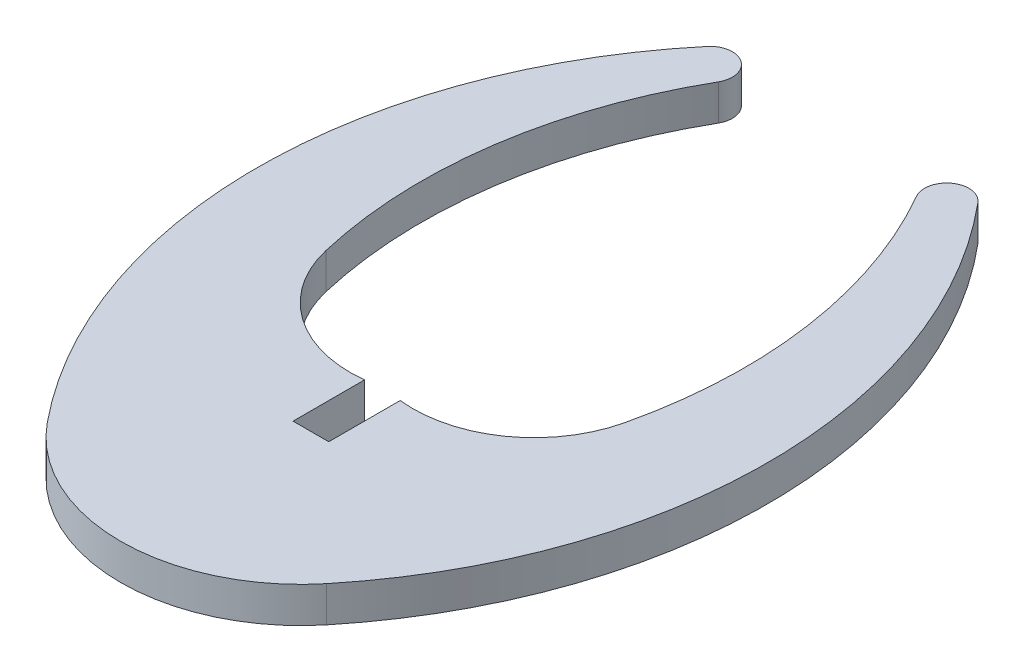
ISO-10303-21;
HEADER;
FILE_DESCRIPTION(('STEP AP214'),'2;1');
FILE_NAME('part.step','',(''),(''),'','','');
FILE_SCHEMA(('AUTOMOTIVE_DESIGN { 1 0 10303 214 1 1 1 1 }'));
ENDSEC;
DATA;
#1=APPLICATION_CONTEXT('core data for automotive mechanical design processes');
#2=APPLICATION_PROTOCOL_DEFINITION('international standard','automotive_design',2000,#1);
#3=PRODUCT_CONTEXT('',#1,'mechanical');
#4=PRODUCT('Part','Part','',(#3));
#5=PRODUCT_RELATED_PRODUCT_CATEGORY('part','',(#4));
#6=PRODUCT_DEFINITION_FORMATION('','',#4);
#7=PRODUCT_DEFINITION_CONTEXT('part definition',#1,'design');
#8=PRODUCT_DEFINITION('design','',#6,#7);
#9=PRODUCT_DEFINITION_SHAPE('','',#8);
#10=(LENGTH_UNIT() NAMED_UNIT(*) SI_UNIT(.MILLI.,.METRE.));
#11=(NAMED_UNIT(*) PLANE_ANGLE_UNIT() SI_UNIT($,.RADIAN.));
#12=(NAMED_UNIT(*) SI_UNIT($,.STERADIAN.) SOLID_ANGLE_UNIT());
#13=UNCERTAINTY_MEASURE_WITH_UNIT(LENGTH_MEASURE(1.E-05),#10,'distance_accuracy_value','');
#14=(GEOMETRIC_REPRESENTATION_CONTEXT(3) GLOBAL_UNCERTAINTY_ASSIGNED_CONTEXT((#13)) GLOBAL_UNIT_ASSIGNED_CONTEXT((#10,
#11,#12)) REPRESENTATION_CONTEXT('',''));
#15=CARTESIAN_POINT('',(0.,0.,0.));
#16=DIRECTION('',(0.,0.,1.));
#17=DIRECTION('',(1.,0.,0.));
#18=AXIS2_PLACEMENT_3D('',#15,#16,#17);
#19=CARTESIAN_POINT('',(-41982.755885,3.,-18425.403028));
#20=DIRECTION('',(-0.999999945617391,0.,0.000329795715776615));
#21=DIRECTION('',(0.000329795715776615,0.,0.999999945617391));
#22=AXIS2_PLACEMENT_3D('',#19,#20,#21);
#23=PLANE('',#22);
#24=DIRECTION('',(-0.000329795715776615,0.,-0.999999945617391));
#25=VECTOR('',#24,1.);
#26=CARTESIAN_POINT('',(-41982.755885,0.,-18425.403028));
#27=LINE('',#26,#25);
#28=CARTESIAN_POINT('',(-41982.753906,0.,-18419.402344));
#29=VERTEX_POINT('',#28);
#30=CARTESIAN_POINT('',(-41982.755885,0.,-18425.403028));
#31=VERTEX_POINT('',#30);
#32=EDGE_CURVE('E155',#29,#31,#27,.T.);
#33=ORIENTED_EDGE('',*,*,#32,.T.);
#34=DIRECTION('',(0.,-1.,0.));
#35=VECTOR('',#34,1.);
#36=CARTESIAN_POINT('',(-41982.755885,3.,-18425.403028));
#37=LINE('',#36,#35);
#38=CARTESIAN_POINT('',(-41982.755885,3.,-18425.403028));
#39=VERTEX_POINT('',#38);
#40=EDGE_CURVE('E11',#39,#31,#37,.T.);
#41=ORIENTED_EDGE('',*,*,#40,.F.);
#42=DIRECTION('',(-0.000329795715776615,0.,-0.999999945617391));
#43=VECTOR('',#42,1.);
#44=CARTESIAN_POINT('',(-41982.755885,3.,-18425.403028));
#45=LINE('',#44,#43);
#46=CARTESIAN_POINT('',(-41982.753906,3.,-18419.402344));
#47=VERTEX_POINT('',#46);
#48=EDGE_CURVE('E177',#47,#39,#45,.T.);
#49=ORIENTED_EDGE('',*,*,#48,.F.);
#50=DIRECTION('',(0.,-1.,0.));
#51=VECTOR('',#50,1.);
#52=CARTESIAN_POINT('',(-41982.753906,3.,-18419.402344));
#53=LINE('',#52,#51);
#54=EDGE_CURVE('E151',#47,#29,#53,.T.);
#55=ORIENTED_EDGE('',*,*,#54,.T.);
#56=EDGE_LOOP('',(#33,#41,#49,#55));
#57=FACE_BOUND('',#56,.T.);
#58=ADVANCED_FACE('F35',(#57),#23,.F.);
#59=CARTESIAN_POINT('',(-41983.8853105874,3.,-18435.5029115237));
#60=DIRECTION('',(0.,-1.,0.));
#61=DIRECTION('',(0.,0.,-1.));
#62=AXIS2_PLACEMENT_3D('',#59,#60,#61);
#63=CYLINDRICAL_SURFACE('',#62,10.1628366782971);
#64=CARTESIAN_POINT('',(-41983.8853105874,0.,-18435.5029115237));
#65=DIRECTION('',(0.,-1.,0.));
#66=DIRECTION('',(0.,0.,1.));
#67=AXIS2_PLACEMENT_3D('',#64,#65,#66);
#68=CIRCLE('',#67,10.1628366782971);
#69=CARTESIAN_POINT('',(-41993.780939,0.,-18433.18779));
#70=VERTEX_POINT('',#69);
#71=EDGE_CURVE('E158',#31,#70,#68,.T.);
#72=ORIENTED_EDGE('',*,*,#71,.T.);
#73=DIRECTION('',(0.,-1.,0.));
#74=VECTOR('',#73,1.);
#75=CARTESIAN_POINT('',(-41993.780939,3.,-18433.18779));
#76=LINE('',#75,#74);
#77=CARTESIAN_POINT('',(-41993.780939,3.,-18433.18779));
#78=VERTEX_POINT('',#77);
#79=EDGE_CURVE('E43',#78,#70,#76,.T.);
#80=ORIENTED_EDGE('',*,*,#79,.F.);
#81=CARTESIAN_POINT('',(-41983.8853105874,3.,-18435.5029115237));
#82=DIRECTION('',(0.,-1.,0.));
#83=DIRECTION('',(0.,0.,1.));
#84=AXIS2_PLACEMENT_3D('',#81,#82,#83);
#85=CIRCLE('',#84,10.1628366782971);
#86=EDGE_CURVE('E106',#39,#78,#85,.T.);
#87=ORIENTED_EDGE('',*,*,#86,.F.);
#88=ORIENTED_EDGE('',*,*,#40,.T.);
#89=EDGE_LOOP('',(#72,#80,#87,#88));
#90=FACE_BOUND('',#89,.T.);
#91=ADVANCED_FACE('F255',(#90),#63,.F.);
#92=CARTESIAN_POINT('',(-41955.2299410757,3.,-18442.2204008405));
#93=DIRECTION('',(0.,-1.,0.));
#94=DIRECTION('',(0.,0.,-1.));
#95=AXIS2_PLACEMENT_3D('',#92,#93,#94);
#96=CYLINDRICAL_SURFACE('',#95,39.5950438761964);
#97=CARTESIAN_POINT('',(-41955.2299410757,0.,-18442.2204008405));
#98=DIRECTION('',(0.,-1.,0.));
#99=DIRECTION('',(0.,0.,1.));
#100=AXIS2_PLACEMENT_3D('',#97,#98,#99);
#101=CIRCLE('',#100,39.5950438761964);
#102=CARTESIAN_POINT('',(-41989.570389,0.,-18461.930833));
#103=VERTEX_POINT('',#102);
#104=EDGE_CURVE('E160',#70,#103,#101,.T.);
#105=ORIENTED_EDGE('',*,*,#104,.T.);
#106=DIRECTION('',(0.,-1.,0.));
#107=VECTOR('',#106,1.);
#108=CARTESIAN_POINT('',(-41989.570389,3.,-18461.930833));
#109=LINE('',#108,#107);
#110=CARTESIAN_POINT('',(-41989.570389,3.,-18461.930833));
#111=VERTEX_POINT('',#110);
#112=EDGE_CURVE('E196',#111,#103,#109,.T.);
#113=ORIENTED_EDGE('',*,*,#112,.F.);
#114=CARTESIAN_POINT('',(-41955.2299410757,3.,-18442.2204008405));
#115=DIRECTION('',(0.,-1.,0.));
#116=DIRECTION('',(0.,0.,1.));
#117=AXIS2_PLACEMENT_3D('',#114,#115,#116);
#118=CIRCLE('',#117,39.5950438761964);
#119=EDGE_CURVE('E204',#78,#111,#118,.T.);
#120=ORIENTED_EDGE('',*,*,#119,.F.);
#121=ORIENTED_EDGE('',*,*,#79,.T.);
#122=EDGE_LOOP('',(#105,#113,#120,#121));
#123=FACE_BOUND('',#122,.T.);
#124=ADVANCED_FACE('F202',(#123),#96,.F.);
#125=CARTESIAN_POINT('',(-41991.1827796206,3.,-18462.8549007188));
#126=DIRECTION('',(0.,-1.,0.));
#127=DIRECTION('',(0.,0.,-1.));
#128=AXIS2_PLACEMENT_3D('',#125,#126,#127);
#129=CYLINDRICAL_SURFACE('',#128,1.8584145561032);
#130=CARTESIAN_POINT('',(-41991.1827796206,0.,-18462.8549007188));
#131=DIRECTION('',(0.,1.,0.));
#132=DIRECTION('',(0.,0.,1.));
#133=AXIS2_PLACEMENT_3D('',#130,#131,#132);
#134=CIRCLE('',#133,1.8584145561032);
#135=CARTESIAN_POINT('',(-41992.6064460001,0.,-18464.049421));
#136=VERTEX_POINT('',#135);
#137=EDGE_CURVE('E162',#103,#136,#134,.T.);
#138=ORIENTED_EDGE('',*,*,#137,.T.);
#139=DIRECTION('',(0.,-1.,0.));
#140=VECTOR('',#139,1.);
#141=CARTESIAN_POINT('',(-41992.6064460001,3.,-18464.049421));
#142=LINE('',#141,#140);
#143=CARTESIAN_POINT('',(-41992.6064460001,3.,-18464.049421));
#144=VERTEX_POINT('',#143);
#145=EDGE_CURVE('E193',#144,#136,#142,.T.);
#146=ORIENTED_EDGE('',*,*,#145,.F.);
#147=CARTESIAN_POINT('',(-41991.1827796206,3.,-18462.8549007188));
#148=DIRECTION('',(0.,1.,0.));
#149=DIRECTION('',(0.,0.,1.));
#150=AXIS2_PLACEMENT_3D('',#147,#148,#149);
#151=CIRCLE('',#150,1.8584145561032);
#152=EDGE_CURVE('E222',#111,#144,#151,.T.);
#153=ORIENTED_EDGE('',*,*,#152,.F.);
#154=ORIENTED_EDGE('',*,*,#112,.T.);
#155=EDGE_LOOP('',(#138,#146,#153,#154));
#156=FACE_BOUND('',#155,.T.);
#157=ADVANCED_FACE('F213',(#156),#129,.T.);
#158=CARTESIAN_POINT('',(-41959.4843939636,3.,-18436.2941148301));
#159=DIRECTION('',(0.,-1.,0.));
#160=DIRECTION('',(0.,0.,-1.));
#161=AXIS2_PLACEMENT_3D('',#158,#159,#160);
#162=CYLINDRICAL_SURFACE('',#161,43.2137403113042);
#163=CARTESIAN_POINT('',(-41959.4843939636,0.,-18436.2941148301));
#164=DIRECTION('',(0.,1.,0.));
#165=DIRECTION('',(0.,0.,1.));
#166=AXIS2_PLACEMENT_3D('',#163,#164,#165);
#167=CIRCLE('',#166,43.2137403113042);
#168=CARTESIAN_POINT('',(-41992.984684,0.,-18408.996534));
#169=VERTEX_POINT('',#168);
#170=EDGE_CURVE('E164',#136,#169,#167,.T.);
#171=ORIENTED_EDGE('',*,*,#170,.T.);
#172=DIRECTION('',(0.,-1.,0.));
#173=VECTOR('',#172,1.);
#174=CARTESIAN_POINT('',(-41992.984684,3.,-18408.996534));
#175=LINE('',#174,#173);
#176=CARTESIAN_POINT('',(-41992.984684,3.,-18408.996534));
#177=VERTEX_POINT('',#176);
#178=EDGE_CURVE('E190',#177,#169,#175,.T.);
#179=ORIENTED_EDGE('',*,*,#178,.F.);
#180=CARTESIAN_POINT('',(-41959.4843939636,3.,-18436.2941148301));
#181=DIRECTION('',(0.,1.,0.));
#182=DIRECTION('',(0.,0.,1.));
#183=AXIS2_PLACEMENT_3D('',#180,#181,#182);
#184=CIRCLE('',#183,43.2137403113042);
#185=EDGE_CURVE('E219',#144,#177,#184,.T.);
#186=ORIENTED_EDGE('',*,*,#185,.F.);
#187=ORIENTED_EDGE('',*,*,#145,.T.);
#188=EDGE_LOOP('',(#171,#179,#186,#187));
#189=FACE_BOUND('',#188,.T.);
#190=ADVANCED_FACE('F217',(#189),#162,.T.);
#191=CARTESIAN_POINT('',(-41981.2566091463,3.,-18418.5546868443));
#192=DIRECTION('',(0.,-1.,0.));
#193=DIRECTION('',(0.,0.,-1.));
#194=AXIS2_PLACEMENT_3D('',#191,#192,#193);
#195=CYLINDRICAL_SURFACE('',#194,15.1296406292003);
#196=CARTESIAN_POINT('',(-41981.2566091463,0.,-18418.5546868443));
#197=DIRECTION('',(0.,1.,0.));
#198=DIRECTION('',(0.,0.,1.));
#199=AXIS2_PLACEMENT_3D('',#196,#197,#198);
#200=CIRCLE('',#199,15.1296406292003);
#201=CARTESIAN_POINT('',(-41969.530626,0.,-18408.993968));
#202=VERTEX_POINT('',#201);
#203=EDGE_CURVE('E166',#169,#202,#200,.T.);
#204=ORIENTED_EDGE('',*,*,#203,.T.);
#205=DIRECTION('',(0.,-1.,0.));
#206=VECTOR('',#205,1.);
#207=CARTESIAN_POINT('',(-41969.530626,3.,-18408.993968));
#208=LINE('',#207,#206);
#209=CARTESIAN_POINT('',(-41969.530626,3.,-18408.993968));
#210=VERTEX_POINT('',#209);
#211=EDGE_CURVE('E187',#210,#202,#208,.T.);
#212=ORIENTED_EDGE('',*,*,#211,.F.);
#213=CARTESIAN_POINT('',(-41981.2566091463,3.,-18418.5546868443));
#214=DIRECTION('',(0.,1.,0.));
#215=DIRECTION('',(0.,0.,1.));
#216=AXIS2_PLACEMENT_3D('',#213,#214,#215);
#217=CIRCLE('',#216,15.1296406292003);
#218=EDGE_CURVE('E221',#177,#210,#217,.T.);
#219=ORIENTED_EDGE('',*,*,#218,.F.);
#220=ORIENTED_EDGE('',*,*,#178,.T.);
#221=EDGE_LOOP('',(#204,#212,#219,#220));
#222=FACE_BOUND('',#221,.T.);
#223=ADVANCED_FACE('F268',(#222),#195,.T.);
#224=CARTESIAN_POINT('',(-42003.0195178407,3.,-18436.3007296343));
#225=DIRECTION('',(0.,-1.,0.));
#226=DIRECTION('',(0.,0.,-1.));
#227=AXIS2_PLACEMENT_3D('',#224,#225,#226);
#228=CYLINDRICAL_SURFACE('',#227,43.2107059382055);
#229=CARTESIAN_POINT('',(-42003.0195178407,0.,-18436.3007296343));
#230=DIRECTION('',(0.,1.,0.));
#231=DIRECTION('',(0.,0.,1.));
#232=AXIS2_PLACEMENT_3D('',#229,#230,#231);
#233=CIRCLE('',#232,43.2107059382055);
#234=CARTESIAN_POINT('',(-41969.8920510001,0.,-18464.044847));
#235=VERTEX_POINT('',#234);
#236=EDGE_CURVE('E168',#202,#235,#233,.T.);
#237=ORIENTED_EDGE('',*,*,#236,.T.);
#238=DIRECTION('',(0.,-1.,0.));
#239=VECTOR('',#238,1.);
#240=CARTESIAN_POINT('',(-41969.8920510001,3.,-18464.044847));
#241=LINE('',#240,#239);
#242=CARTESIAN_POINT('',(-41969.8920510001,3.,-18464.044847));
#243=VERTEX_POINT('',#242);
#244=EDGE_CURVE('E184',#243,#235,#241,.T.);
#245=ORIENTED_EDGE('',*,*,#244,.F.);
#246=CARTESIAN_POINT('',(-42003.0195178407,3.,-18436.3007296343));
#247=DIRECTION('',(0.,1.,0.));
#248=DIRECTION('',(0.,0.,1.));
#249=AXIS2_PLACEMENT_3D('',#246,#247,#248);
#250=CIRCLE('',#249,43.2107059382055);
#251=EDGE_CURVE('E224',#210,#243,#250,.T.);
#252=ORIENTED_EDGE('',*,*,#251,.F.);
#253=ORIENTED_EDGE('',*,*,#211,.T.);
#254=EDGE_LOOP('',(#237,#245,#252,#253));
#255=FACE_BOUND('',#254,.T.);
#256=ADVANCED_FACE('F271',(#255),#228,.T.);
#257=CARTESIAN_POINT('',(-41971.3161001138,3.,-18462.8498222245));
#258=DIRECTION('',(0.,-1.,0.));
#259=DIRECTION('',(0.,0.,-1.));
#260=AXIS2_PLACEMENT_3D('',#257,#258,#259);
#261=CYLINDRICAL_SURFACE('',#260,1.85903203100892);
#262=CARTESIAN_POINT('',(-41971.3161001138,0.,-18462.8498222245));
#263=DIRECTION('',(0.,1.,0.));
#264=DIRECTION('',(0.,0.,1.));
#265=AXIS2_PLACEMENT_3D('',#262,#263,#264);
#266=CIRCLE('',#265,1.85903203100892);
#267=CARTESIAN_POINT('',(-41972.930009,0.,-18461.9271639999));
#268=VERTEX_POINT('',#267);
#269=EDGE_CURVE('E170',#235,#268,#266,.T.);
#270=ORIENTED_EDGE('',*,*,#269,.T.);
#271=DIRECTION('',(0.,-1.,0.));
#272=VECTOR('',#271,1.);
#273=CARTESIAN_POINT('',(-41972.930009,3.,-18461.9271639999));
#274=LINE('',#273,#272);
#275=CARTESIAN_POINT('',(-41972.930009,3.,-18461.9271639999));
#276=VERTEX_POINT('',#275);
#277=EDGE_CURVE('E181',#276,#268,#274,.T.);
#278=ORIENTED_EDGE('',*,*,#277,.F.);
#279=CARTESIAN_POINT('',(-41971.3161001138,3.,-18462.8498222245));
#280=DIRECTION('',(0.,1.,0.));
#281=DIRECTION('',(0.,0.,1.));
#282=AXIS2_PLACEMENT_3D('',#279,#280,#281);
#283=CIRCLE('',#282,1.85903203100892);
#284=EDGE_CURVE('E230',#243,#276,#283,.T.);
#285=ORIENTED_EDGE('',*,*,#284,.F.);
#286=ORIENTED_EDGE('',*,*,#244,.T.);
#287=EDGE_LOOP('',(#270,#278,#285,#286));
#288=FACE_BOUND('',#287,.T.);
#289=ADVANCED_FACE('F236',(#288),#261,.T.);
#290=CARTESIAN_POINT('',(-42007.2733840697,3.,-18442.2242472093));
#291=DIRECTION('',(0.,-1.,0.));
#292=DIRECTION('',(0.,0.,-1.));
#293=AXIS2_PLACEMENT_3D('',#290,#291,#292);
#294=CYLINDRICAL_SURFACE('',#293,39.5938422136017);
#295=CARTESIAN_POINT('',(-42007.2733840697,0.,-18442.2242472093));
#296=DIRECTION('',(0.,-1.,0.));
#297=DIRECTION('',(0.,0.,1.));
#298=AXIS2_PLACEMENT_3D('',#295,#296,#297);
#299=CIRCLE('',#298,39.5938422136017);
#300=CARTESIAN_POINT('',(-41968.725069,0.,-18433.185456));
#301=VERTEX_POINT('',#300);
#302=EDGE_CURVE('E172',#268,#301,#299,.T.);
#303=ORIENTED_EDGE('',*,*,#302,.T.);
#304=DIRECTION('',(0.,-1.,0.));
#305=VECTOR('',#304,1.);
#306=CARTESIAN_POINT('',(-41968.725069,3.,-18433.185456));
#307=LINE('',#306,#305);
#308=CARTESIAN_POINT('',(-41968.725069,3.,-18433.185456));
#309=VERTEX_POINT('',#308);
#310=EDGE_CURVE('E146',#309,#301,#307,.T.);
#311=ORIENTED_EDGE('',*,*,#310,.F.);
#312=CARTESIAN_POINT('',(-42007.2733840697,3.,-18442.2242472093));
#313=DIRECTION('',(0.,-1.,0.));
#314=DIRECTION('',(0.,0.,1.));
#315=AXIS2_PLACEMENT_3D('',#312,#313,#314);
#316=CIRCLE('',#315,39.5938422136017);
#317=EDGE_CURVE('E137',#276,#309,#316,.T.);
#318=ORIENTED_EDGE('',*,*,#317,.F.);
#319=ORIENTED_EDGE('',*,*,#277,.T.);
#320=EDGE_LOOP('',(#303,#311,#318,#319));
#321=FACE_BOUND('',#320,.T.);
#322=ADVANCED_FACE('F240',(#321),#294,.F.);
#323=CARTESIAN_POINT('',(-41978.6219159094,3.,-18435.5033261793));
#324=DIRECTION('',(0.,-1.,0.));
#325=DIRECTION('',(0.,0.,-1.));
#326=AXIS2_PLACEMENT_3D('',#323,#324,#325);
#327=CYLINDRICAL_SURFACE('',#326,10.1646495717016);
#328=CARTESIAN_POINT('',(-41978.6219159094,0.,-18435.5033261793));
#329=DIRECTION('',(0.,-1.,0.));
#330=DIRECTION('',(0.,0.,1.));
#331=AXIS2_PLACEMENT_3D('',#328,#329,#330);
#332=CIRCLE('',#331,10.1646495717016);
#333=CARTESIAN_POINT('',(-41979.757812,0.,-18425.402344));
#334=VERTEX_POINT('',#333);
#335=EDGE_CURVE('E145',#301,#334,#332,.T.);
#336=ORIENTED_EDGE('',*,*,#335,.T.);
#337=DIRECTION('',(0.,-1.,0.));
#338=VECTOR('',#337,1.);
#339=CARTESIAN_POINT('',(-41979.757812,3.,-18425.402344));
#340=LINE('',#339,#338);
#341=CARTESIAN_POINT('',(-41979.757812,3.,-18425.402344));
#342=VERTEX_POINT('',#341);
#343=EDGE_CURVE('E142',#342,#334,#340,.T.);
#344=ORIENTED_EDGE('',*,*,#343,.F.);
#345=CARTESIAN_POINT('',(-41978.6219159094,3.,-18435.5033261793));
#346=DIRECTION('',(0.,-1.,0.));
#347=DIRECTION('',(0.,0.,1.));
#348=AXIS2_PLACEMENT_3D('',#345,#346,#347);
#349=CIRCLE('',#348,10.1646495717016);
#350=EDGE_CURVE('E131',#309,#342,#349,.T.);
#351=ORIENTED_EDGE('',*,*,#350,.F.);
#352=ORIENTED_EDGE('',*,*,#310,.T.);
#353=EDGE_LOOP('',(#336,#344,#351,#352));
#354=FACE_BOUND('',#353,.T.);
#355=ADVANCED_FACE('F143',(#354),#327,.F.);
#356=CARTESIAN_POINT('',(-41979.757812,3.,-18419.402344));
#357=DIRECTION('',(1.,0.,0.));
#358=DIRECTION('',(0.,0.,-1.));
#359=AXIS2_PLACEMENT_3D('',#356,#357,#358);
#360=PLANE('',#359);
#361=DIRECTION('',(0.,0.,1.));
#362=VECTOR('',#361,1.);
#363=CARTESIAN_POINT('',(-41979.757812,0.,-18419.402344));
#364=LINE('',#363,#362);
#365=CARTESIAN_POINT('',(-41979.757812,0.,-18419.402344));
#366=VERTEX_POINT('',#365);
#367=EDGE_CURVE('E92',#334,#366,#364,.T.);
#368=ORIENTED_EDGE('',*,*,#367,.T.);
#369=DIRECTION('',(0.,-1.,0.));
#370=VECTOR('',#369,1.);
#371=CARTESIAN_POINT('',(-41979.757812,3.,-18419.402344));
#372=LINE('',#371,#370);
#373=CARTESIAN_POINT('',(-41979.757812,3.,-18419.402344));
#374=VERTEX_POINT('',#373);
#375=EDGE_CURVE('E147',#374,#366,#372,.T.);
#376=ORIENTED_EDGE('',*,*,#375,.F.);
#377=DIRECTION('',(0.,0.,1.));
#378=VECTOR('',#377,1.);
#379=CARTESIAN_POINT('',(-41979.757812,3.,-18419.402344));
#380=LINE('',#379,#378);
#381=EDGE_CURVE('E135',#342,#374,#380,.T.);
#382=ORIENTED_EDGE('',*,*,#381,.F.);
#383=ORIENTED_EDGE('',*,*,#343,.T.);
#384=EDGE_LOOP('',(#368,#376,#382,#383));
#385=FACE_BOUND('',#384,.T.);
#386=ADVANCED_FACE('F149',(#385),#360,.F.);
#387=CARTESIAN_POINT('',(-41982.753906,3.,-18419.402344));
#388=DIRECTION('',(0.,0.,1.));
#389=DIRECTION('',(1.,0.,0.));
#390=AXIS2_PLACEMENT_3D('',#387,#388,#389);
#391=PLANE('',#390);
#392=DIRECTION('',(-1.,0.,0.));
#393=VECTOR('',#392,1.);
#394=CARTESIAN_POINT('',(-41982.753906,0.,-18419.402344));
#395=LINE('',#394,#393);
#396=EDGE_CURVE('E98',#366,#29,#395,.T.);
#397=ORIENTED_EDGE('',*,*,#396,.T.);
#398=ORIENTED_EDGE('',*,*,#54,.F.);
#399=DIRECTION('',(-1.,0.,0.));
#400=VECTOR('',#399,1.);
#401=CARTESIAN_POINT('',(-41982.753906,3.,-18419.402344));
#402=LINE('',#401,#400);
#403=EDGE_CURVE('E51',#374,#47,#402,.T.);
#404=ORIENTED_EDGE('',*,*,#403,.F.);
#405=ORIENTED_EDGE('',*,*,#375,.T.);
#406=EDGE_LOOP('',(#397,#398,#404,#405));
#407=FACE_BOUND('',#406,.T.);
#408=ADVANCED_FACE('F244',(#407),#391,.F.);
#409=CARTESIAN_POINT('',(-41978.6219159094,3.,-18435.5033261793));
#410=DIRECTION('',(0.,1.,0.));
#411=DIRECTION('',(0.,0.,1.));
#412=AXIS2_PLACEMENT_3D('',#409,#410,#411);
#413=PLANE('',#412);
#414=ORIENTED_EDGE('',*,*,#48,.T.);
#415=ORIENTED_EDGE('',*,*,#86,.T.);
#416=ORIENTED_EDGE('',*,*,#119,.T.);
#417=ORIENTED_EDGE('',*,*,#152,.T.);
#418=ORIENTED_EDGE('',*,*,#185,.T.);
#419=ORIENTED_EDGE('',*,*,#218,.T.);
#420=ORIENTED_EDGE('',*,*,#251,.T.);
#421=ORIENTED_EDGE('',*,*,#284,.T.);
#422=ORIENTED_EDGE('',*,*,#317,.T.);
#423=ORIENTED_EDGE('',*,*,#350,.T.);
#424=ORIENTED_EDGE('',*,*,#381,.T.);
#425=ORIENTED_EDGE('',*,*,#403,.T.);
#426=EDGE_LOOP('',(#414,#415,#416,#417,#418,#419,#420,#421,#422,#423,#424,#425));
#427=FACE_BOUND('',#426,.T.);
#428=ADVANCED_FACE('F133',(#427),#413,.T.);
#429=CARTESIAN_POINT('',(-41978.6219159094,0.,-18435.5033261793));
#430=DIRECTION('',(0.,1.,0.));
#431=DIRECTION('',(0.,0.,1.));
#432=AXIS2_PLACEMENT_3D('',#429,#430,#431);
#433=PLANE('',#432);
#434=ORIENTED_EDGE('',*,*,#32,.F.);
#435=ORIENTED_EDGE('',*,*,#396,.F.);
#436=ORIENTED_EDGE('',*,*,#367,.F.);
#437=ORIENTED_EDGE('',*,*,#335,.F.);
#438=ORIENTED_EDGE('',*,*,#302,.F.);
#439=ORIENTED_EDGE('',*,*,#269,.F.);
#440=ORIENTED_EDGE('',*,*,#236,.F.);
#441=ORIENTED_EDGE('',*,*,#203,.F.);
#442=ORIENTED_EDGE('',*,*,#170,.F.);
#443=ORIENTED_EDGE('',*,*,#137,.F.);
#444=ORIENTED_EDGE('',*,*,#104,.F.);
#445=ORIENTED_EDGE('',*,*,#71,.F.);
#446=EDGE_LOOP('',(#434,#435,#436,#437,#438,#439,#440,#441,#442,#443,#444,#445));
#447=FACE_BOUND('',#446,.T.);
#448=ADVANCED_FACE('F208',(#447),#433,.F.);
#449=CLOSED_SHELL('',(#58,#91,#124,#157,#190,#223,#256,#289,#322,#355,#386,#408,#428,#448));
#450=MANIFOLD_SOLID_BREP('B2',#449);
#451=ADVANCED_BREP_SHAPE_REPRESENTATION('',(#18,#450),#14);
#452=SHAPE_DEFINITION_REPRESENTATION(#9,#451);
ENDSEC;
END-ISO-10303-21;
